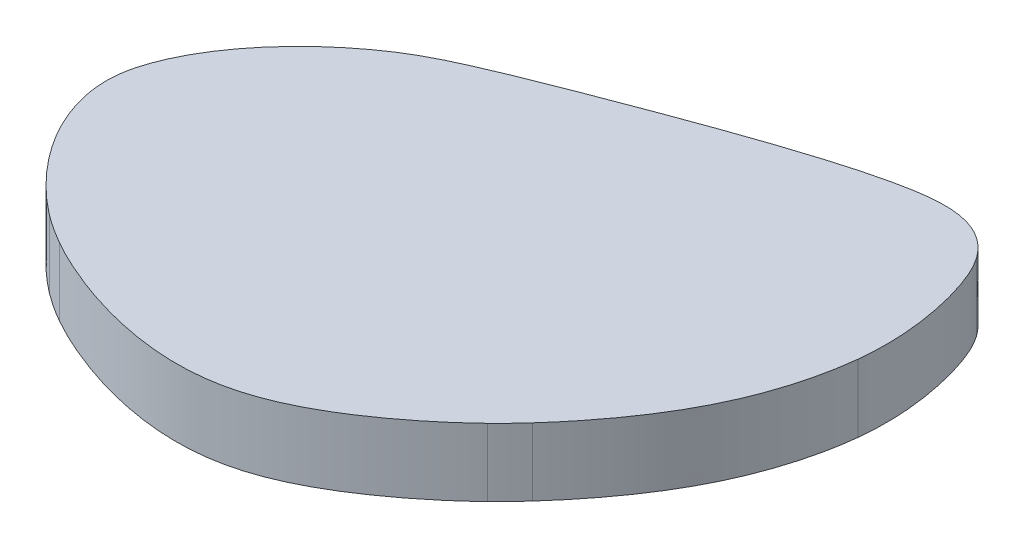
ISO-10303-21;
HEADER;
FILE_DESCRIPTION(('STEP AP214'),'2;1');
FILE_NAME('part.step','',(''),(''),'','','');
FILE_SCHEMA(('AUTOMOTIVE_DESIGN { 1 0 10303 214 1 1 1 1 }'));
ENDSEC;
DATA;
#1=APPLICATION_CONTEXT('core data for automotive mechanical design processes');
#2=APPLICATION_PROTOCOL_DEFINITION('international standard','automotive_design',2000,#1);
#3=PRODUCT_CONTEXT('',#1,'mechanical');
#4=PRODUCT('Part','Part','',(#3));
#5=PRODUCT_RELATED_PRODUCT_CATEGORY('part','',(#4));
#6=PRODUCT_DEFINITION_FORMATION('','',#4);
#7=PRODUCT_DEFINITION_CONTEXT('part definition',#1,'design');
#8=PRODUCT_DEFINITION('design','',#6,#7);
#9=PRODUCT_DEFINITION_SHAPE('','',#8);
#10=(LENGTH_UNIT() NAMED_UNIT(*) SI_UNIT(.MILLI.,.METRE.));
#11=(NAMED_UNIT(*) PLANE_ANGLE_UNIT() SI_UNIT($,.RADIAN.));
#12=(NAMED_UNIT(*) SI_UNIT($,.STERADIAN.) SOLID_ANGLE_UNIT());
#13=UNCERTAINTY_MEASURE_WITH_UNIT(LENGTH_MEASURE(1.E-05),#10,'distance_accuracy_value','');
#14=(GEOMETRIC_REPRESENTATION_CONTEXT(3) GLOBAL_UNCERTAINTY_ASSIGNED_CONTEXT((#13)) GLOBAL_UNIT_ASSIGNED_CONTEXT((#10,
#11,#12)) REPRESENTATION_CONTEXT('',''));
#15=CARTESIAN_POINT('',(0.,0.,0.));
#16=DIRECTION('',(0.,0.,1.));
#17=DIRECTION('',(1.,0.,0.));
#18=AXIS2_PLACEMENT_3D('',#15,#16,#17);
#19=CARTESIAN_POINT('',(9.40449868987964,3.,-11.5325854162938));
#20=CARTESIAN_POINT('',(9.16948442996962,3.,-11.5217221758173));
#21=CARTESIAN_POINT('',(8.92883504326752,3.,-11.4968709062009));
#22=CARTESIAN_POINT('',(8.43955719733286,3.,-11.4284514459938));
#23=CARTESIAN_POINT('',(8.18986316259901,3.,-11.3846441268283));
#24=CARTESIAN_POINT('',(7.44104489746572,3.,-11.2355085131655));
#25=CARTESIAN_POINT('',(6.94264632868885,3.,-11.1134848834787));
#26=CARTESIAN_POINT('',(5.94915151704761,3.,-10.8468969870508));
#27=CARTESIAN_POINT('',(5.45756725828822,3.,-10.7027869868344));
#28=CARTESIAN_POINT('',(4.48048933265871,3.,-10.4013940294703));
#29=CARTESIAN_POINT('',(3.99506288789248,3.,-10.2439687411717));
#30=CARTESIAN_POINT('',(3.51163535597027,3.,-10.0819931193588));
#31=B_SPLINE_CURVE_WITH_KNOTS('',3,(#19,#20,#21,#22,#23,#24,#25,#26,#27,#28,#29,#30),
.UNSPECIFIED.,.F.,.F.,(4,2,2,2,2,4),(0.,0.12500000000001,0.250000000000019,0.500000000000013,
0.750000000000006,1.),.UNSPECIFIED.);
#32=DIRECTION('',(0.,-1.,0.));
#33=VECTOR('',#32,1.);
#34=SURFACE_OF_LINEAR_EXTRUSION('',#31,#33);
#35=CARTESIAN_POINT('',(9.40449868987964,0.,-11.5325854162938));
#36=CARTESIAN_POINT('',(9.16948442996962,0.,-11.5217221758173));
#37=CARTESIAN_POINT('',(8.92883504326752,0.,-11.4968709062009));
#38=CARTESIAN_POINT('',(8.43955719733286,0.,-11.4284514459938));
#39=CARTESIAN_POINT('',(8.18986316259901,0.,-11.3846441268283));
#40=CARTESIAN_POINT('',(7.44104489746572,0.,-11.2355085131655));
#41=CARTESIAN_POINT('',(6.94264632868885,0.,-11.1134848834787));
#42=CARTESIAN_POINT('',(5.94915151704761,0.,-10.8468969870508));
#43=CARTESIAN_POINT('',(5.45756725828822,0.,-10.7027869868344));
#44=CARTESIAN_POINT('',(4.48048933265871,0.,-10.4013940294703));
#45=CARTESIAN_POINT('',(3.99506288789248,0.,-10.2439687411717));
#46=CARTESIAN_POINT('',(3.51163535597027,0.,-10.0819931193588));
#47=B_SPLINE_CURVE_WITH_KNOTS('',3,(#35,#36,#37,#38,#39,#40,#41,#42,#43,#44,#45,#46),
.UNSPECIFIED.,.F.,.F.,(4,2,2,2,2,4),(0.,0.12500000000001,0.250000000000019,0.500000000000013,
0.750000000000006,1.),.UNSPECIFIED.);
#48=CARTESIAN_POINT('',(9.40449868987964,0.,-11.5325854162938));
#49=VERTEX_POINT('',#48);
#50=CARTESIAN_POINT('',(3.51163535597027,0.,-10.0819931193588));
#51=VERTEX_POINT('',#50);
#52=EDGE_CURVE('E488',#49,#51,#47,.T.);
#53=ORIENTED_EDGE('',*,*,#52,.T.);
#54=DIRECTION('',(0.,-1.,0.));
#55=VECTOR('',#54,1.);
#56=CARTESIAN_POINT('',(3.51163535597027,3.,-10.0819931193588));
#57=LINE('',#56,#55);
#58=CARTESIAN_POINT('',(3.51163535597027,3.,-10.0819931193588));
#59=VERTEX_POINT('',#58);
#60=EDGE_CURVE('E11',#59,#51,#57,.T.);
#61=ORIENTED_EDGE('',*,*,#60,.F.);
#62=CARTESIAN_POINT('',(3.51163535597027,3.,-10.0819931193588));
#63=CARTESIAN_POINT('',(3.99506288789248,3.,-10.2439687411717));
#64=CARTESIAN_POINT('',(4.48048933265871,3.,-10.4013940294703));
#65=CARTESIAN_POINT('',(5.45756725828822,3.,-10.7027869868344));
#66=CARTESIAN_POINT('',(5.94915151704761,3.,-10.8468969870508));
#67=CARTESIAN_POINT('',(6.94264632868885,3.,-11.1134848834787));
#68=CARTESIAN_POINT('',(7.44104489746572,3.,-11.2355085131655));
#69=CARTESIAN_POINT('',(8.18986316259901,3.,-11.3846441268283));
#70=CARTESIAN_POINT('',(8.43955719733286,3.,-11.4284514459938));
#71=CARTESIAN_POINT('',(8.92883504326752,3.,-11.4968709062009));
#72=CARTESIAN_POINT('',(9.16948442996962,3.,-11.5217221758173));
#73=CARTESIAN_POINT('',(9.40449868987964,3.,-11.5325854162938));
#74=B_SPLINE_CURVE_WITH_KNOTS('',3,(#62,#63,#64,#65,#66,#67,#68,#69,#70,#71,#72,#73),
.UNSPECIFIED.,.F.,.F.,(4,2,2,2,2,4),(0.,0.249999999999994,0.499999999999987,0.749999999999981,
0.87499999999999,1.),.UNSPECIFIED.);
#75=CARTESIAN_POINT('',(9.40449868987964,3.,-11.5325854162938));
#76=VERTEX_POINT('',#75);
#77=EDGE_CURVE('E513',#76,#59,#74,.F.);
#78=ORIENTED_EDGE('',*,*,#77,.F.);
#79=DIRECTION('',(0.,-1.,0.));
#80=VECTOR('',#79,1.);
#81=CARTESIAN_POINT('',(9.40449868987964,3.,-11.5325854162938));
#82=LINE('',#81,#80);
#83=EDGE_CURVE('E495',#76,#49,#82,.T.);
#84=ORIENTED_EDGE('',*,*,#83,.T.);
#85=EDGE_LOOP('',(#53,#61,#78,#84));
#86=FACE_BOUND('',#85,.T.);
#87=ADVANCED_FACE('F35',(#86),#34,.F.);
#88=CARTESIAN_POINT('',(3.51163535597027,3.,-10.0819931193588));
#89=CARTESIAN_POINT('',(2.68377735277675,3.,-9.80461376881425));
#90=CARTESIAN_POINT('',(1.86383555225972,3.,-9.51516032948546));
#91=CARTESIAN_POINT('',(0.230253692953097,3.,-8.92378979456154));
#92=CARTESIAN_POINT('',(-0.583224168511143,3.,-8.62160702577619));
#93=CARTESIAN_POINT('',(-2.20639603395772,3.,-8.00841939522107));
#94=CARTESIAN_POINT('',(-3.01627374298358,3.,-7.69763269894974));
#95=CARTESIAN_POINT('',(-4.62896295436094,3.,-7.0621633178482));
#96=CARTESIAN_POINT('',(-5.43274745274563,3.,-6.73892739926996));
#97=CARTESIAN_POINT('',(-6.21792626872969,3.,-6.38973778627228));
#98=B_SPLINE_CURVE_WITH_KNOTS('',3,(#88,#89,#90,#91,#92,#93,#94,#95,#96,#97),.UNSPECIFIED.,.F.,
.F.,(4,2,2,2,4),(0.,0.25,0.5,0.75,1.),.UNSPECIFIED.);
#99=DIRECTION('',(0.,-1.,0.));
#100=VECTOR('',#99,1.);
#101=SURFACE_OF_LINEAR_EXTRUSION('',#98,#100);
#102=CARTESIAN_POINT('',(3.51163535597027,0.,-10.0819931193588));
#103=CARTESIAN_POINT('',(2.68377735277675,0.,-9.80461376881425));
#104=CARTESIAN_POINT('',(1.86383555225972,0.,-9.51516032948546));
#105=CARTESIAN_POINT('',(0.230253692953097,0.,-8.92378979456154));
#106=CARTESIAN_POINT('',(-0.583224168511143,0.,-8.62160702577619));
#107=CARTESIAN_POINT('',(-2.20639603395772,0.,-8.00841939522107));
#108=CARTESIAN_POINT('',(-3.01627374298358,0.,-7.69763269894974));
#109=CARTESIAN_POINT('',(-4.62896295436094,0.,-7.0621633178482));
#110=CARTESIAN_POINT('',(-5.43274745274563,0.,-6.73892739926996));
#111=CARTESIAN_POINT('',(-6.21792626872969,0.,-6.38973778627228));
#112=B_SPLINE_CURVE_WITH_KNOTS('',3,(#102,#103,#104,#105,#106,#107,#108,#109,#110,#111),
.UNSPECIFIED.,.F.,.F.,(4,2,2,2,4),(0.,0.25,0.5,0.75,1.),.UNSPECIFIED.);
#113=CARTESIAN_POINT('',(-6.21792626872969,0.,-6.38973778627228));
#114=VERTEX_POINT('',#113);
#115=EDGE_CURVE('E487',#51,#114,#112,.T.);
#116=ORIENTED_EDGE('',*,*,#115,.T.);
#117=DIRECTION('',(0.,-1.,0.));
#118=VECTOR('',#117,1.);
#119=CARTESIAN_POINT('',(-6.21792626872969,3.,-6.38973778627228));
#120=LINE('',#119,#118);
#121=CARTESIAN_POINT('',(-6.21792626872969,3.,-6.38973778627228));
#122=VERTEX_POINT('',#121);
#123=EDGE_CURVE('E48',#122,#114,#120,.T.);
#124=ORIENTED_EDGE('',*,*,#123,.F.);
#125=CARTESIAN_POINT('',(-6.21792626872969,3.,-6.38973778627228));
#126=CARTESIAN_POINT('',(-5.43274745274563,3.,-6.73892739926996));
#127=CARTESIAN_POINT('',(-4.62896295436094,3.,-7.0621633178482));
#128=CARTESIAN_POINT('',(-3.01627374298358,3.,-7.69763269894974));
#129=CARTESIAN_POINT('',(-2.20639603395772,3.,-8.00841939522107));
#130=CARTESIAN_POINT('',(-0.583224168511143,3.,-8.62160702577619));
#131=CARTESIAN_POINT('',(0.230253692953097,3.,-8.92378979456154));
#132=CARTESIAN_POINT('',(1.86383555225972,3.,-9.51516032948546));
#133=CARTESIAN_POINT('',(2.68377735277675,3.,-9.80461376881425));
#134=CARTESIAN_POINT('',(3.51163535597027,3.,-10.0819931193588));
#135=B_SPLINE_CURVE_WITH_KNOTS('',3,(#125,#126,#127,#128,#129,#130,#131,#132,#133,#134),
.UNSPECIFIED.,.F.,.F.,(4,2,2,2,4),(0.,0.25,0.5,0.75,1.),.UNSPECIFIED.);
#136=EDGE_CURVE('E115',#59,#122,#135,.F.);
#137=ORIENTED_EDGE('',*,*,#136,.F.);
#138=ORIENTED_EDGE('',*,*,#60,.T.);
#139=EDGE_LOOP('',(#116,#124,#137,#138));
#140=FACE_BOUND('',#139,.T.);
#141=ADVANCED_FACE('F285',(#140),#101,.F.);
#142=CARTESIAN_POINT('',(-6.21792626872969,3.,-6.38973778627228));
#143=CARTESIAN_POINT('',(-6.73238281775807,3.,-6.16094546585577));
#144=CARTESIAN_POINT('',(-7.23446368264175,3.,-5.92162292411225));
#145=CARTESIAN_POINT('',(-8.18354620617628,3.,-5.3954559909416));
#146=CARTESIAN_POINT('',(-8.62655194044665,3.,-5.10527133357896));
#147=CARTESIAN_POINT('',(-9.04879031403666,3.,-4.79311725753839));
#148=B_SPLINE_CURVE_WITH_KNOTS('',3,(#142,#143,#144,#145,#146,#147),.UNSPECIFIED.,.F.,.F.,(4,2,
4),(0.,0.5,1.),.UNSPECIFIED.);
#149=DIRECTION('',(0.,-1.,0.));
#150=VECTOR('',#149,1.);
#151=SURFACE_OF_LINEAR_EXTRUSION('',#148,#150);
#152=CARTESIAN_POINT('',(-6.21792626872969,0.,-6.38973778627228));
#153=CARTESIAN_POINT('',(-6.73238281775807,0.,-6.16094546585577));
#154=CARTESIAN_POINT('',(-7.23446368264175,0.,-5.92162292411225));
#155=CARTESIAN_POINT('',(-8.18354620617628,0.,-5.3954559909416));
#156=CARTESIAN_POINT('',(-8.62655194044665,0.,-5.10527133357896));
#157=CARTESIAN_POINT('',(-9.04879031403666,0.,-4.79311725753839));
#158=B_SPLINE_CURVE_WITH_KNOTS('',3,(#152,#153,#154,#155,#156,#157),.UNSPECIFIED.,.F.,.F.,(4,2,
4),(0.,0.5,1.),.UNSPECIFIED.);
#159=CARTESIAN_POINT('',(-9.04879031403666,0.,-4.79311725753839));
#160=VERTEX_POINT('',#159);
#161=EDGE_CURVE('E374',#114,#160,#158,.T.);
#162=ORIENTED_EDGE('',*,*,#161,.T.);
#163=DIRECTION('',(0.,-1.,0.));
#164=VECTOR('',#163,1.);
#165=CARTESIAN_POINT('',(-9.04879031403666,3.,-4.79311725753839));
#166=LINE('',#165,#164);
#167=CARTESIAN_POINT('',(-9.04879031403666,3.,-4.79311725753839));
#168=VERTEX_POINT('',#167);
#169=EDGE_CURVE('E373',#168,#160,#166,.T.);
#170=ORIENTED_EDGE('',*,*,#169,.F.);
#171=CARTESIAN_POINT('',(-9.04879031403666,3.,-4.79311725753839));
#172=CARTESIAN_POINT('',(-8.62655194044665,3.,-5.10527133357896));
#173=CARTESIAN_POINT('',(-8.18354620617628,3.,-5.3954559909416));
#174=CARTESIAN_POINT('',(-7.23446368264175,3.,-5.92162292411225));
#175=CARTESIAN_POINT('',(-6.73238281775807,3.,-6.16094546585577));
#176=CARTESIAN_POINT('',(-6.21792626872969,3.,-6.38973778627228));
#177=B_SPLINE_CURVE_WITH_KNOTS('',3,(#171,#172,#173,#174,#175,#176),.UNSPECIFIED.,.F.,.F.,(4,2,
4),(0.,0.5,1.),.UNSPECIFIED.);
#178=EDGE_CURVE('E365',#122,#168,#177,.F.);
#179=ORIENTED_EDGE('',*,*,#178,.F.);
#180=ORIENTED_EDGE('',*,*,#123,.T.);
#181=EDGE_LOOP('',(#162,#170,#179,#180));
#182=FACE_BOUND('',#181,.T.);
#183=ADVANCED_FACE('F295',(#182),#151,.F.);
#184=CARTESIAN_POINT('',(-9.04879031403666,3.,-4.79311725753839));
#185=CARTESIAN_POINT('',(-9.57259381540526,3.,-4.40587770707362));
#186=CARTESIAN_POINT('',(-10.0620145931181,3.,-3.9924961553342));
#187=CARTESIAN_POINT('',(-10.976896057484,3.,-3.11899282223826));
#188=CARTESIAN_POINT('',(-11.403271889311,3.,-2.6568625017252));
#189=CARTESIAN_POINT('',(-12.1805384485814,3.,-1.68119816733442));
#190=CARTESIAN_POINT('',(-12.5306293409266,3.,-1.16673020119945));
#191=CARTESIAN_POINT('',(-12.9800653843957,3.,-0.351507060059986));
#192=CARTESIAN_POINT('',(-13.1162939653667,3.,-0.073646384200321));
#193=CARTESIAN_POINT('',(-13.3552240747009,3.,0.496551982563431));
#194=CARTESIAN_POINT('',(-13.4585321407873,3.,0.788753111312324));
#195=CARTESIAN_POINT('',(-13.5371022169438,3.,1.09048307716147));
#196=B_SPLINE_CURVE_WITH_KNOTS('',3,(#184,#185,#186,#187,#188,#189,#190,#191,#192,#193,#194,
#195),.UNSPECIFIED.,.F.,.F.,(4,2,2,2,2,4),(0.,0.25,0.499999999999999,0.749999999999999,
0.874999999999999,1.),.UNSPECIFIED.);
#197=DIRECTION('',(0.,-1.,0.));
#198=VECTOR('',#197,1.);
#199=SURFACE_OF_LINEAR_EXTRUSION('',#196,#198);
#200=CARTESIAN_POINT('',(-9.04879031403666,0.,-4.79311725753839));
#201=CARTESIAN_POINT('',(-9.57259381540526,0.,-4.40587770707362));
#202=CARTESIAN_POINT('',(-10.0620145931181,0.,-3.9924961553342));
#203=CARTESIAN_POINT('',(-10.976896057484,0.,-3.11899282223826));
#204=CARTESIAN_POINT('',(-11.403271889311,0.,-2.6568625017252));
#205=CARTESIAN_POINT('',(-12.1805384485814,0.,-1.68119816733442));
#206=CARTESIAN_POINT('',(-12.5306293409266,0.,-1.16673020119945));
#207=CARTESIAN_POINT('',(-12.9800653843957,0.,-0.351507060059986));
#208=CARTESIAN_POINT('',(-13.1162939653667,0.,-0.073646384200321));
#209=CARTESIAN_POINT('',(-13.3552240747009,0.,0.496551982563431));
#210=CARTESIAN_POINT('',(-13.4585321407873,0.,0.788753111312324));
#211=CARTESIAN_POINT('',(-13.5371022169438,0.,1.09048307716147));
#212=B_SPLINE_CURVE_WITH_KNOTS('',3,(#200,#201,#202,#203,#204,#205,#206,#207,#208,#209,#210,
#211),.UNSPECIFIED.,.F.,.F.,(4,2,2,2,2,4),(0.,0.25,0.499999999999999,0.749999999999999,
0.874999999999999,1.),.UNSPECIFIED.);
#213=CARTESIAN_POINT('',(-13.5371022169438,0.,1.09048307716147));
#214=VERTEX_POINT('',#213);
#215=EDGE_CURVE('E356',#160,#214,#212,.T.);
#216=ORIENTED_EDGE('',*,*,#215,.T.);
#217=DIRECTION('',(0.,-1.,0.));
#218=VECTOR('',#217,1.);
#219=CARTESIAN_POINT('',(-13.5371022169438,3.,1.09048307716147));
#220=LINE('',#219,#218);
#221=CARTESIAN_POINT('',(-13.5371022169438,3.,1.09048307716147));
#222=VERTEX_POINT('',#221);
#223=EDGE_CURVE('E376',#222,#214,#220,.T.);
#224=ORIENTED_EDGE('',*,*,#223,.F.);
#225=CARTESIAN_POINT('',(-13.5371022169438,3.,1.09048307716147));
#226=CARTESIAN_POINT('',(-13.4585321407873,3.,0.788753111312324));
#227=CARTESIAN_POINT('',(-13.3552240747009,3.,0.496551982563431));
#228=CARTESIAN_POINT('',(-13.1162939653667,3.,-0.073646384200321));
#229=CARTESIAN_POINT('',(-12.9800653843957,3.,-0.351507060059986));
#230=CARTESIAN_POINT('',(-12.5306293409266,3.,-1.16673020119945));
#231=CARTESIAN_POINT('',(-12.1805384485814,3.,-1.68119816733442));
#232=CARTESIAN_POINT('',(-11.403271889311,3.,-2.6568625017252));
#233=CARTESIAN_POINT('',(-10.976896057484,3.,-3.11899282223826));
#234=CARTESIAN_POINT('',(-10.0620145931181,3.,-3.9924961553342));
#235=CARTESIAN_POINT('',(-9.57259381540526,3.,-4.40587770707362));
#236=CARTESIAN_POINT('',(-9.04879031403666,3.,-4.79311725753839));
#237=B_SPLINE_CURVE_WITH_KNOTS('',3,(#225,#226,#227,#228,#229,#230,#231,#232,#233,#234,#235,
#236),.UNSPECIFIED.,.F.,.F.,(4,2,2,2,2,4),(0.,0.125000000000001,0.250000000000001,
0.500000000000001,0.75,1.),.UNSPECIFIED.);
#238=EDGE_CURVE('E368',#168,#222,#237,.F.);
#239=ORIENTED_EDGE('',*,*,#238,.F.);
#240=ORIENTED_EDGE('',*,*,#169,.T.);
#241=EDGE_LOOP('',(#216,#224,#239,#240));
#242=FACE_BOUND('',#241,.T.);
#243=ADVANCED_FACE('F327',(#242),#199,.F.);
#244=CARTESIAN_POINT('',(-13.5371022169438,3.,1.09048307716147));
#245=CARTESIAN_POINT('',(-13.6045033382816,3.,1.34932128908943));
#246=CARTESIAN_POINT('',(-13.6533123475046,3.,1.61066942936922));
#247=CARTESIAN_POINT('',(-13.6986330861484,3.,2.13842771563338));
#248=CARTESIAN_POINT('',(-13.6947668012091,3.,2.40484478231628));
#249=CARTESIAN_POINT('',(-13.669095991079,3.,2.67430412253611));
#250=B_SPLINE_CURVE_WITH_KNOTS('',3,(#244,#245,#246,#247,#248,#249),.UNSPECIFIED.,.F.,.F.,(4,2,
4),(0.,0.5,1.),.UNSPECIFIED.);
#251=DIRECTION('',(0.,-1.,0.));
#252=VECTOR('',#251,1.);
#253=SURFACE_OF_LINEAR_EXTRUSION('',#250,#252);
#254=CARTESIAN_POINT('',(-13.5371022169438,0.,1.09048307716147));
#255=CARTESIAN_POINT('',(-13.6045033382816,0.,1.34932128908943));
#256=CARTESIAN_POINT('',(-13.6533123475046,0.,1.61066942936922));
#257=CARTESIAN_POINT('',(-13.6986330861484,0.,2.13842771563338));
#258=CARTESIAN_POINT('',(-13.6947668012091,0.,2.40484478231628));
#259=CARTESIAN_POINT('',(-13.669095991079,0.,2.67430412253611));
#260=B_SPLINE_CURVE_WITH_KNOTS('',3,(#254,#255,#256,#257,#258,#259),.UNSPECIFIED.,.F.,.F.,(4,2,
4),(0.,0.5,1.),.UNSPECIFIED.);
#261=CARTESIAN_POINT('',(-13.669095991079,0.,2.67430412253611));
#262=VERTEX_POINT('',#261);
#263=EDGE_CURVE('E481',#214,#262,#260,.T.);
#264=ORIENTED_EDGE('',*,*,#263,.T.);
#265=DIRECTION('',(0.,-1.,0.));
#266=VECTOR('',#265,1.);
#267=CARTESIAN_POINT('',(-13.669095991079,3.,2.67430412253611));
#268=LINE('',#267,#266);
#269=CARTESIAN_POINT('',(-13.669095991079,3.,2.67430412253611));
#270=VERTEX_POINT('',#269);
#271=EDGE_CURVE('E752',#270,#262,#268,.T.);
#272=ORIENTED_EDGE('',*,*,#271,.F.);
#273=CARTESIAN_POINT('',(-13.669095991079,3.,2.67430412253611));
#274=CARTESIAN_POINT('',(-13.6947668012091,3.,2.40484478231628));
#275=CARTESIAN_POINT('',(-13.6986330861484,3.,2.13842771563338));
#276=CARTESIAN_POINT('',(-13.6533123475046,3.,1.61066942936922));
#277=CARTESIAN_POINT('',(-13.6045033382816,3.,1.34932128908943));
#278=CARTESIAN_POINT('',(-13.5371022169438,3.,1.09048307716147));
#279=B_SPLINE_CURVE_WITH_KNOTS('',3,(#273,#274,#275,#276,#277,#278),.UNSPECIFIED.,.F.,.F.,(4,2,
4),(0.,0.5,1.),.UNSPECIFIED.);
#280=EDGE_CURVE('E379',#222,#270,#279,.F.);
#281=ORIENTED_EDGE('',*,*,#280,.F.);
#282=ORIENTED_EDGE('',*,*,#223,.T.);
#283=EDGE_LOOP('',(#264,#272,#281,#282));
#284=FACE_BOUND('',#283,.T.);
#285=ADVANCED_FACE('F331',(#284),#253,.F.);
#286=CARTESIAN_POINT('',(-13.669095991079,3.,2.67430412253611));
#287=CARTESIAN_POINT('',(-13.6147224729071,3.,3.24504779129842));
#288=CARTESIAN_POINT('',(-13.465072101567,3.,3.80194779583387));
#289=CARTESIAN_POINT('',(-13.1323267921578,3.,4.62518272633644));
#290=CARTESIAN_POINT('',(-13.0027710476083,3.,4.89731418090062));
#291=CARTESIAN_POINT('',(-12.7167081485253,3.,5.42476473443272));
#292=CARTESIAN_POINT('',(-12.5592701180152,3.,5.68175265159388));
#293=CARTESIAN_POINT('',(-12.0487095160506,3.,6.43472982768702));
#294=CARTESIAN_POINT('',(-11.6581424337949,3.,6.91487579660268));
#295=CARTESIAN_POINT('',(-10.7900867173167,3.,7.82595612707851));
#296=CARTESIAN_POINT('',(-10.3221618314719,3.,8.25214747014283));
#297=CARTESIAN_POINT('',(-9.81277976489491,3.,8.63842530460388));
#298=B_SPLINE_CURVE_WITH_KNOTS('',3,(#286,#287,#288,#289,#290,#291,#292,#293,#294,#295,#296,
#297),.UNSPECIFIED.,.F.,.F.,(4,2,2,2,2,4),(0.,0.249999999999982,0.374999999999986,
0.49999999999999,0.749999999999995,1.),.UNSPECIFIED.);
#299=DIRECTION('',(0.,-1.,0.));
#300=VECTOR('',#299,1.);
#301=SURFACE_OF_LINEAR_EXTRUSION('',#298,#300);
#302=CARTESIAN_POINT('',(-13.669095991079,0.,2.67430412253611));
#303=CARTESIAN_POINT('',(-13.6147224729071,0.,3.24504779129842));
#304=CARTESIAN_POINT('',(-13.465072101567,0.,3.80194779583387));
#305=CARTESIAN_POINT('',(-13.1323267921578,0.,4.62518272633644));
#306=CARTESIAN_POINT('',(-13.0027710476083,0.,4.89731418090062));
#307=CARTESIAN_POINT('',(-12.7167081485253,0.,5.42476473443272));
#308=CARTESIAN_POINT('',(-12.5592701180152,0.,5.68175265159388));
#309=CARTESIAN_POINT('',(-12.0487095160506,0.,6.43472982768702));
#310=CARTESIAN_POINT('',(-11.6581424337949,0.,6.91487579660268));
#311=CARTESIAN_POINT('',(-10.7900867173167,0.,7.82595612707851));
#312=CARTESIAN_POINT('',(-10.3221618314719,0.,8.25214747014283));
#313=CARTESIAN_POINT('',(-9.81277976489491,0.,8.63842530460388));
#314=B_SPLINE_CURVE_WITH_KNOTS('',3,(#302,#303,#304,#305,#306,#307,#308,#309,#310,#311,#312,
#313),.UNSPECIFIED.,.F.,.F.,(4,2,2,2,2,4),(0.,0.249999999999982,0.374999999999986,
0.49999999999999,0.749999999999995,1.),.UNSPECIFIED.);
#315=CARTESIAN_POINT('',(-9.81277976489491,0.,8.63842530460388));
#316=VERTEX_POINT('',#315);
#317=EDGE_CURVE('E476',#262,#316,#314,.T.);
#318=ORIENTED_EDGE('',*,*,#317,.T.);
#319=DIRECTION('',(0.,-1.,0.));
#320=VECTOR('',#319,1.);
#321=CARTESIAN_POINT('',(-9.81277976489491,3.,8.63842530460388));
#322=LINE('',#321,#320);
#323=CARTESIAN_POINT('',(-9.81277976489491,3.,8.63842530460388));
#324=VERTEX_POINT('',#323);
#325=EDGE_CURVE('E781',#324,#316,#322,.T.);
#326=ORIENTED_EDGE('',*,*,#325,.F.);
#327=CARTESIAN_POINT('',(-9.81277976489491,3.,8.63842530460388));
#328=CARTESIAN_POINT('',(-10.3221618314719,3.,8.25214747014283));
#329=CARTESIAN_POINT('',(-10.7900867173167,3.,7.82595612707851));
#330=CARTESIAN_POINT('',(-11.6581424337949,3.,6.91487579660268));
#331=CARTESIAN_POINT('',(-12.0487095160506,3.,6.43472982768702));
#332=CARTESIAN_POINT('',(-12.5592701180152,3.,5.68175265159388));
#333=CARTESIAN_POINT('',(-12.7167081485253,3.,5.42476473443272));
#334=CARTESIAN_POINT('',(-13.0027710476083,3.,4.89731418090062));
#335=CARTESIAN_POINT('',(-13.1323267921578,3.,4.62518272633644));
#336=CARTESIAN_POINT('',(-13.465072101567,3.,3.80194779583387));
#337=CARTESIAN_POINT('',(-13.6147224729071,3.,3.24504779129842));
#338=CARTESIAN_POINT('',(-13.669095991079,3.,2.67430412253611));
#339=B_SPLINE_CURVE_WITH_KNOTS('',3,(#327,#328,#329,#330,#331,#332,#333,#334,#335,#336,#337,
#338),.UNSPECIFIED.,.F.,.F.,(4,2,2,2,2,4),(0.,0.250000000000005,0.50000000000001,
0.625000000000014,0.750000000000018,1.),.UNSPECIFIED.);
#340=EDGE_CURVE('E380',#270,#324,#339,.F.);
#341=ORIENTED_EDGE('',*,*,#340,.F.);
#342=ORIENTED_EDGE('',*,*,#271,.T.);
#343=EDGE_LOOP('',(#318,#326,#341,#342));
#344=FACE_BOUND('',#343,.T.);
#345=ADVANCED_FACE('F445',(#344),#301,.F.);
#346=CARTESIAN_POINT('',(-9.81277976489491,3.,8.63842530460388));
#347=CARTESIAN_POINT('',(-9.40343625663864,3.,8.94884126600457));
#348=CARTESIAN_POINT('',(-8.97118766516436,3.,9.22809808730794));
#349=CARTESIAN_POINT('',(-8.52193759572628,3.,9.48393361835374));
#350=B_SPLINE_CURVE_WITH_KNOTS('',3,(#346,#347,#348,#349),.UNSPECIFIED.,.F.,.F.,(4,4),(0.,1.),.UNSPECIFIED.);
#351=DIRECTION('',(0.,-1.,0.));
#352=VECTOR('',#351,1.);
#353=SURFACE_OF_LINEAR_EXTRUSION('',#350,#352);
#354=CARTESIAN_POINT('',(-9.81277976489491,0.,8.63842530460388));
#355=CARTESIAN_POINT('',(-9.40343625663864,0.,8.94884126600457));
#356=CARTESIAN_POINT('',(-8.97118766516436,0.,9.22809808730794));
#357=CARTESIAN_POINT('',(-8.52193759572628,0.,9.48393361835374));
#358=B_SPLINE_CURVE_WITH_KNOTS('',3,(#354,#355,#356,#357),.UNSPECIFIED.,.F.,.F.,(4,4),(0.,1.),.UNSPECIFIED.);
#359=CARTESIAN_POINT('',(-8.52193759572628,0.,9.48393361835374));
#360=VERTEX_POINT('',#359);
#361=EDGE_CURVE('E467',#316,#360,#358,.T.);
#362=ORIENTED_EDGE('',*,*,#361,.T.);
#363=DIRECTION('',(0.,-1.,0.));
#364=VECTOR('',#363,1.);
#365=CARTESIAN_POINT('',(-8.52193759572628,3.,9.48393361835374));
#366=LINE('',#365,#364);
#367=CARTESIAN_POINT('',(-8.52193759572628,3.,9.48393361835374));
#368=VERTEX_POINT('',#367);
#369=EDGE_CURVE('E401',#368,#360,#366,.T.);
#370=ORIENTED_EDGE('',*,*,#369,.F.);
#371=CARTESIAN_POINT('',(-8.52193759572628,3.,9.48393361835374));
#372=CARTESIAN_POINT('',(-8.97118766516436,3.,9.22809808730794));
#373=CARTESIAN_POINT('',(-9.40343625663864,3.,8.94884126600457));
#374=CARTESIAN_POINT('',(-9.81277976489491,3.,8.63842530460388));
#375=B_SPLINE_CURVE_WITH_KNOTS('',3,(#371,#372,#373,#374),.UNSPECIFIED.,.F.,.F.,(4,4),(0.,1.),.UNSPECIFIED.);
#376=EDGE_CURVE('E382',#324,#368,#375,.F.);
#377=ORIENTED_EDGE('',*,*,#376,.F.);
#378=ORIENTED_EDGE('',*,*,#325,.T.);
#379=EDGE_LOOP('',(#362,#370,#377,#378));
#380=FACE_BOUND('',#379,.T.);
#381=ADVANCED_FACE('F442',(#380),#353,.F.);
#382=CARTESIAN_POINT('',(-8.52193759572628,3.,9.48393361835374));
#383=CARTESIAN_POINT('',(-7.86405668328516,3.,9.85857866361554));
#384=CARTESIAN_POINT('',(-7.18143256147119,3.,10.171414143231));
#385=CARTESIAN_POINT('',(-5.78638657795527,3.,10.7217086444897));
#386=CARTESIAN_POINT('',(-5.07185543548161,3.,10.9535376616802));
#387=CARTESIAN_POINT('',(-3.60527888625806,3.,11.3168666237345));
#388=CARTESIAN_POINT('',(-2.84947534911307,3.,11.4475782525453));
#389=CARTESIAN_POINT('',(-1.71821800290107,3.,11.5318237285615));
#390=CARTESIAN_POINT('',(-1.34024123356613,3.,11.5415476562711));
#391=CARTESIAN_POINT('',(-0.582297463101903,3.,11.5173035042926));
#392=CARTESIAN_POINT('',(-0.199738299052624,3.,11.4827527968533));
#393=CARTESIAN_POINT('',(0.92358170909734,3.,11.3044984143813));
#394=CARTESIAN_POINT('',(1.64363223502894,3.,11.086301788032));
#395=CARTESIAN_POINT('',(2.6907578221701,3.,10.6447584440295));
#396=CARTESIAN_POINT('',(3.03465279902015,3.,10.4782818192673));
#397=CARTESIAN_POINT('',(3.70062405165472,3.,10.1217783995795));
#398=CARTESIAN_POINT('',(4.0247759542611,3.,9.93107104447086));
#399=CARTESIAN_POINT('',(4.97712039997889,3.,9.33035035546884));
#400=CARTESIAN_POINT('',(5.58540791500917,3.,8.89202763303319));
#401=CARTESIAN_POINT('',(6.76400709185277,3.,7.96012609109291));
#402=CARTESIAN_POINT('',(7.33408199455755,3.,7.4662502485716));
#403=CARTESIAN_POINT('',(7.87948311482258,3.,6.93606945640489));
#404=B_SPLINE_CURVE_WITH_KNOTS('',3,(#382,#383,#384,#385,#386,#387,#388,#389,#390,#391,#392,
#393,#394,#395,#396,#397,#398,#399,#400,#401,#402,#403),.UNSPECIFIED.,.F.,.F.,(4,2,2,2,2,2,2,2,
2,2,4),(0.,0.125000000000009,0.250000000000018,0.375000000000027,0.437500000000029,
0.500000000000031,0.62500000000002,0.687500000000014,0.750000000000009,0.875000000000004,1.),.UNSPECIFIED.);
#405=DIRECTION('',(0.,-1.,0.));
#406=VECTOR('',#405,1.);
#407=SURFACE_OF_LINEAR_EXTRUSION('',#404,#406);
#408=CARTESIAN_POINT('',(-8.52193759572628,0.,9.48393361835374));
#409=CARTESIAN_POINT('',(-7.86405668328516,0.,9.85857866361554));
#410=CARTESIAN_POINT('',(-7.18143256147119,0.,10.171414143231));
#411=CARTESIAN_POINT('',(-5.78638657795527,0.,10.7217086444897));
#412=CARTESIAN_POINT('',(-5.07185543548161,0.,10.9535376616802));
#413=CARTESIAN_POINT('',(-3.60527888625806,0.,11.3168666237345));
#414=CARTESIAN_POINT('',(-2.84947534911307,0.,11.4475782525453));
#415=CARTESIAN_POINT('',(-1.71821800290107,0.,11.5318237285615));
#416=CARTESIAN_POINT('',(-1.34024123356613,0.,11.5415476562711));
#417=CARTESIAN_POINT('',(-0.582297463101903,0.,11.5173035042926));
#418=CARTESIAN_POINT('',(-0.199738299052624,0.,11.4827527968533));
#419=CARTESIAN_POINT('',(0.92358170909734,0.,11.3044984143813));
#420=CARTESIAN_POINT('',(1.64363223502894,0.,11.086301788032));
#421=CARTESIAN_POINT('',(2.6907578221701,0.,10.6447584440295));
#422=CARTESIAN_POINT('',(3.03465279902015,0.,10.4782818192673));
#423=CARTESIAN_POINT('',(3.70062405165472,0.,10.1217783995795));
#424=CARTESIAN_POINT('',(4.0247759542611,0.,9.93107104447086));
#425=CARTESIAN_POINT('',(4.97712039997889,0.,9.33035035546884));
#426=CARTESIAN_POINT('',(5.58540791500917,0.,8.89202763303319));
#427=CARTESIAN_POINT('',(6.76400709185277,0.,7.96012609109291));
#428=CARTESIAN_POINT('',(7.33408199455755,0.,7.4662502485716));
#429=CARTESIAN_POINT('',(7.87948311482258,0.,6.93606945640489));
#430=B_SPLINE_CURVE_WITH_KNOTS('',3,(#408,#409,#410,#411,#412,#413,#414,#415,#416,#417,#418,
#419,#420,#421,#422,#423,#424,#425,#426,#427,#428,#429),.UNSPECIFIED.,.F.,.F.,(4,2,2,2,2,2,2,2,
2,2,4),(0.,0.125000000000009,0.250000000000018,0.375000000000027,0.437500000000029,
0.500000000000031,0.62500000000002,0.687500000000014,0.750000000000009,0.875000000000004,1.),.UNSPECIFIED.);
#431=CARTESIAN_POINT('',(7.87948311482258,0.,6.93606945640489));
#432=VERTEX_POINT('',#431);
#433=EDGE_CURVE('E397',#360,#432,#430,.T.);
#434=ORIENTED_EDGE('',*,*,#433,.T.);
#435=DIRECTION('',(0.,-1.,0.));
#436=VECTOR('',#435,1.);
#437=CARTESIAN_POINT('',(7.87948311482258,3.,6.93606945640489));
#438=LINE('',#437,#436);
#439=CARTESIAN_POINT('',(7.87948311482258,3.,6.93606945640489));
#440=VERTEX_POINT('',#439);
#441=EDGE_CURVE('E394',#440,#432,#438,.T.);
#442=ORIENTED_EDGE('',*,*,#441,.F.);
#443=CARTESIAN_POINT('',(7.87948311482258,3.,6.93606945640489));
#444=CARTESIAN_POINT('',(7.33408199455755,3.,7.4662502485716));
#445=CARTESIAN_POINT('',(6.76400709185277,3.,7.96012609109291));
#446=CARTESIAN_POINT('',(5.58540791500917,3.,8.89202763303319));
#447=CARTESIAN_POINT('',(4.97712039997889,3.,9.33035035546884));
#448=CARTESIAN_POINT('',(4.0247759542611,3.,9.93107104447086));
#449=CARTESIAN_POINT('',(3.70062405165472,3.,10.1217783995795));
#450=CARTESIAN_POINT('',(3.03465279902015,3.,10.4782818192673));
#451=CARTESIAN_POINT('',(2.6907578221701,3.,10.6447584440295));
#452=CARTESIAN_POINT('',(1.64363223502894,3.,11.086301788032));
#453=CARTESIAN_POINT('',(0.92358170909734,3.,11.3044984143813));
#454=CARTESIAN_POINT('',(-0.199738299052624,3.,11.4827527968533));
#455=CARTESIAN_POINT('',(-0.582297463101903,3.,11.5173035042926));
#456=CARTESIAN_POINT('',(-1.34024123356613,3.,11.5415476562711));
#457=CARTESIAN_POINT('',(-1.71821800290107,3.,11.5318237285615));
#458=CARTESIAN_POINT('',(-2.84947534911307,3.,11.4475782525453));
#459=CARTESIAN_POINT('',(-3.60527888625806,3.,11.3168666237345));
#460=CARTESIAN_POINT('',(-5.07185543548161,3.,10.9535376616802));
#461=CARTESIAN_POINT('',(-5.78638657795527,3.,10.7217086444897));
#462=CARTESIAN_POINT('',(-7.18143256147119,3.,10.171414143231));
#463=CARTESIAN_POINT('',(-7.86405668328516,3.,9.85857866361554));
#464=CARTESIAN_POINT('',(-8.52193759572628,3.,9.48393361835374));
#465=B_SPLINE_CURVE_WITH_KNOTS('',3,(#443,#444,#445,#446,#447,#448,#449,#450,#451,#452,#453,
#454,#455,#456,#457,#458,#459,#460,#461,#462,#463,#464),.UNSPECIFIED.,.F.,.F.,(4,2,2,2,2,2,2,2,
2,2,4),(0.,0.124999999999996,0.249999999999991,0.312499999999986,0.37499999999998,
0.499999999999969,0.562499999999971,0.624999999999973,0.749999999999982,0.874999999999991,1.),.UNSPECIFIED.);
#466=EDGE_CURVE('E385',#368,#440,#465,.F.);
#467=ORIENTED_EDGE('',*,*,#466,.F.);
#468=ORIENTED_EDGE('',*,*,#369,.T.);
#469=EDGE_LOOP('',(#434,#442,#467,#468));
#470=FACE_BOUND('',#469,.T.);
#471=ADVANCED_FACE('F395',(#470),#407,.F.);
#472=CARTESIAN_POINT('',(7.87948311482258,3.,6.93606945640489));
#473=CARTESIAN_POINT('',(8.2169976311114,3.,6.60797384573324));
#474=CARTESIAN_POINT('',(8.54246376133928,3.,6.26806517082345));
#475=CARTESIAN_POINT('',(8.85886696687911,3.,5.91918810390617));
#476=B_SPLINE_CURVE_WITH_KNOTS('',3,(#472,#473,#474,#475),.UNSPECIFIED.,.F.,.F.,(4,4),(0.,1.),.UNSPECIFIED.);
#477=DIRECTION('',(0.,-1.,0.));
#478=VECTOR('',#477,1.);
#479=SURFACE_OF_LINEAR_EXTRUSION('',#476,#478);
#480=CARTESIAN_POINT('',(7.87948311482258,0.,6.93606945640489));
#481=CARTESIAN_POINT('',(8.2169976311114,0.,6.60797384573324));
#482=CARTESIAN_POINT('',(8.54246376133928,0.,6.26806517082345));
#483=CARTESIAN_POINT('',(8.85886696687911,0.,5.91918810390617));
#484=B_SPLINE_CURVE_WITH_KNOTS('',3,(#480,#481,#482,#483),.UNSPECIFIED.,.F.,.F.,(4,4),(0.,1.),.UNSPECIFIED.);
#485=CARTESIAN_POINT('',(8.85886696687911,0.,5.91918810390617));
#486=VERTEX_POINT('',#485);
#487=EDGE_CURVE('E480',#432,#486,#484,.T.);
#488=ORIENTED_EDGE('',*,*,#487,.T.);
#489=DIRECTION('',(0.,-1.,0.));
#490=VECTOR('',#489,1.);
#491=CARTESIAN_POINT('',(8.85886696687911,3.,5.91918810390617));
#492=LINE('',#491,#490);
#493=CARTESIAN_POINT('',(8.85886696687911,3.,5.91918810390617));
#494=VERTEX_POINT('',#493);
#495=EDGE_CURVE('E162',#494,#486,#492,.T.);
#496=ORIENTED_EDGE('',*,*,#495,.F.);
#497=CARTESIAN_POINT('',(8.85886696687911,3.,5.91918810390617));
#498=CARTESIAN_POINT('',(8.54246376133928,3.,6.26806517082345));
#499=CARTESIAN_POINT('',(8.2169976311114,3.,6.60797384573324));
#500=CARTESIAN_POINT('',(7.87948311482258,3.,6.93606945640489));
#501=B_SPLINE_CURVE_WITH_KNOTS('',3,(#497,#498,#499,#500),.UNSPECIFIED.,.F.,.F.,(4,4),(0.,1.),.UNSPECIFIED.);
#502=EDGE_CURVE('E149',#440,#494,#501,.F.);
#503=ORIENTED_EDGE('',*,*,#502,.F.);
#504=ORIENTED_EDGE('',*,*,#441,.T.);
#505=EDGE_LOOP('',(#488,#496,#503,#504));
#506=FACE_BOUND('',#505,.T.);
#507=ADVANCED_FACE('F403',(#506),#479,.F.);
#508=CARTESIAN_POINT('',(8.85886696687911,3.,5.91918810390617));
#509=CARTESIAN_POINT('',(9.17501200384786,3.,5.57059570254447));
#510=CARTESIAN_POINT('',(9.47780642557074,3.,5.21174449391658));
#511=CARTESIAN_POINT('',(10.0653583454772,3.,4.48038200057548));
#512=CARTESIAN_POINT('',(10.3501124372727,3.,4.10786453796401));
#513=CARTESIAN_POINT('',(10.894645503284,3.,3.34386854830214));
#514=CARTESIAN_POINT('',(11.1545242742398,3.,2.95218337976143));
#515=CARTESIAN_POINT('',(11.6404751068279,3.,2.16009302313152));
#516=CARTESIAN_POINT('',(11.867314109606,3.,1.7583153261641));
#517=CARTESIAN_POINT('',(12.2833933080917,3.,0.9417201520041));
#518=CARTESIAN_POINT('',(12.4722342131991,3.,0.526728056626447));
#519=CARTESIAN_POINT('',(12.8107300359578,3.,-0.315954521647243));
#520=CARTESIAN_POINT('',(12.9614480282783,3.,-0.745894363595578));
#521=CARTESIAN_POINT('',(13.3508996658441,3.,-2.03434566225764));
#522=CARTESIAN_POINT('',(13.527929445775,3.,-2.88254331050443));
#523=CARTESIAN_POINT('',(13.617402736091,3.,-3.71428225224758));
#524=B_SPLINE_CURVE_WITH_KNOTS('',3,(#508,#509,#510,#511,#512,#513,#514,#515,#516,#517,#518,
#519,#520,#521,#522,#523),.UNSPECIFIED.,.F.,.F.,(4,2,2,2,2,2,2,4),(0.,0.125,0.25,0.375,0.5,
0.625,0.75,1.),.UNSPECIFIED.);
#525=DIRECTION('',(0.,-1.,0.));
#526=VECTOR('',#525,1.);
#527=SURFACE_OF_LINEAR_EXTRUSION('',#524,#526);
#528=CARTESIAN_POINT('',(8.85886696687911,0.,5.91918810390617));
#529=CARTESIAN_POINT('',(9.17501200384786,0.,5.57059570254447));
#530=CARTESIAN_POINT('',(9.47780642557074,0.,5.21174449391658));
#531=CARTESIAN_POINT('',(10.0653583454772,0.,4.48038200057548));
#532=CARTESIAN_POINT('',(10.3501124372727,0.,4.10786453796401));
#533=CARTESIAN_POINT('',(10.894645503284,0.,3.34386854830214));
#534=CARTESIAN_POINT('',(11.1545242742398,0.,2.95218337976143));
#535=CARTESIAN_POINT('',(11.6404751068279,0.,2.16009302313152));
#536=CARTESIAN_POINT('',(11.867314109606,0.,1.7583153261641));
#537=CARTESIAN_POINT('',(12.2833933080917,0.,0.9417201520041));
#538=CARTESIAN_POINT('',(12.4722342131991,0.,0.526728056626447));
#539=CARTESIAN_POINT('',(12.8107300359578,0.,-0.315954521647243));
#540=CARTESIAN_POINT('',(12.9614480282783,0.,-0.745894363595578));
#541=CARTESIAN_POINT('',(13.3508996658441,0.,-2.03434566225764));
#542=CARTESIAN_POINT('',(13.527929445775,0.,-2.88254331050443));
#543=CARTESIAN_POINT('',(13.617402736091,0.,-3.71428225224758));
#544=B_SPLINE_CURVE_WITH_KNOTS('',3,(#528,#529,#530,#531,#532,#533,#534,#535,#536,#537,#538,
#539,#540,#541,#542,#543),.UNSPECIFIED.,.F.,.F.,(4,2,2,2,2,2,2,4),(0.,0.125,0.25,0.375,0.5,
0.625,0.75,1.),.UNSPECIFIED.);
#545=CARTESIAN_POINT('',(13.617402736091,0.,-3.71428225224758));
#546=VERTEX_POINT('',#545);
#547=EDGE_CURVE('E160',#486,#546,#544,.T.);
#548=ORIENTED_EDGE('',*,*,#547,.T.);
#549=DIRECTION('',(0.,-1.,0.));
#550=VECTOR('',#549,1.);
#551=CARTESIAN_POINT('',(13.617402736091,3.,-3.71428225224758));
#552=LINE('',#551,#550);
#553=CARTESIAN_POINT('',(13.617402736091,3.,-3.71428225224758));
#554=VERTEX_POINT('',#553);
#555=EDGE_CURVE('E157',#554,#546,#552,.T.);
#556=ORIENTED_EDGE('',*,*,#555,.F.);
#557=CARTESIAN_POINT('',(13.617402736091,3.,-3.71428225224758));
#558=CARTESIAN_POINT('',(13.527929445775,3.,-2.88254331050443));
#559=CARTESIAN_POINT('',(13.3508996658441,3.,-2.03434566225764));
#560=CARTESIAN_POINT('',(12.9614480282783,3.,-0.745894363595578));
#561=CARTESIAN_POINT('',(12.8107300359578,3.,-0.315954521647243));
#562=CARTESIAN_POINT('',(12.4722342131991,3.,0.526728056626447));
#563=CARTESIAN_POINT('',(12.2833933080917,3.,0.9417201520041));
#564=CARTESIAN_POINT('',(11.867314109606,3.,1.7583153261641));
#565=CARTESIAN_POINT('',(11.6404751068279,3.,2.16009302313152));
#566=CARTESIAN_POINT('',(11.1545242742398,3.,2.95218337976143));
#567=CARTESIAN_POINT('',(10.894645503284,3.,3.34386854830214));
#568=CARTESIAN_POINT('',(10.3501124372727,3.,4.10786453796401));
#569=CARTESIAN_POINT('',(10.0653583454772,3.,4.48038200057548));
#570=CARTESIAN_POINT('',(9.47780642557074,3.,5.21174449391658));
#571=CARTESIAN_POINT('',(9.17501200384786,3.,5.57059570254447));
#572=CARTESIAN_POINT('',(8.85886696687911,3.,5.91918810390617));
#573=B_SPLINE_CURVE_WITH_KNOTS('',3,(#557,#558,#559,#560,#561,#562,#563,#564,#565,#566,#567,
#568,#569,#570,#571,#572),.UNSPECIFIED.,.F.,.F.,(4,2,2,2,2,2,2,4),(0.,0.25,0.375,0.5,0.625,0.75,
0.875,1.),.UNSPECIFIED.);
#574=EDGE_CURVE('E141',#494,#554,#573,.F.);
#575=ORIENTED_EDGE('',*,*,#574,.F.);
#576=ORIENTED_EDGE('',*,*,#495,.T.);
#577=EDGE_LOOP('',(#548,#556,#575,#576));
#578=FACE_BOUND('',#577,.T.);
#579=ADVANCED_FACE('F158',(#578),#527,.F.);
#580=CARTESIAN_POINT('',(13.617402736091,3.,-3.71428225224758));
#581=CARTESIAN_POINT('',(13.6913773163926,3.,-4.4019460112975));
#582=CARTESIAN_POINT('',(13.6986330861493,3.,-5.05607891301228));
#583=CARTESIAN_POINT('',(13.6168292681195,3.,-6.2995249331993));
#584=CARTESIAN_POINT('',(13.5293843482253,3.,-6.89099840873572));
#585=CARTESIAN_POINT('',(13.3576433151154,3.,-7.71256305898873));
#586=CARTESIAN_POINT('',(13.2935807285411,3.,-7.97648538927618));
#587=CARTESIAN_POINT('',(13.1516748106571,3.,-8.48496566402187));
#588=CARTESIAN_POINT('',(13.0736960178476,3.,-8.72971103892782));
#589=CARTESIAN_POINT('',(12.8189948401512,3.,-9.42855375363388));
#590=CARTESIAN_POINT('',(12.6248974016404,3.,-9.85093084940269));
#591=CARTESIAN_POINT('',(12.3640409776146,3.,-10.2202388783838));
#592=B_SPLINE_CURVE_WITH_KNOTS('',3,(#580,#581,#582,#583,#584,#585,#586,#587,#588,#589,#590,
#591),.UNSPECIFIED.,.F.,.F.,(4,2,2,2,2,4),(0.,0.249999999999998,0.499999999999996,
0.624999999999995,0.749999999999995,1.),.UNSPECIFIED.);
#593=DIRECTION('',(0.,-1.,0.));
#594=VECTOR('',#593,1.);
#595=SURFACE_OF_LINEAR_EXTRUSION('',#592,#594);
#596=CARTESIAN_POINT('',(13.617402736091,0.,-3.71428225224758));
#597=CARTESIAN_POINT('',(13.6913773163926,0.,-4.4019460112975));
#598=CARTESIAN_POINT('',(13.6986330861493,0.,-5.05607891301228));
#599=CARTESIAN_POINT('',(13.6168292681195,0.,-6.2995249331993));
#600=CARTESIAN_POINT('',(13.5293843482253,0.,-6.89099840873572));
#601=CARTESIAN_POINT('',(13.3576433151154,0.,-7.71256305898873));
#602=CARTESIAN_POINT('',(13.2935807285411,0.,-7.97648538927618));
#603=CARTESIAN_POINT('',(13.1516748106571,0.,-8.48496566402187));
#604=CARTESIAN_POINT('',(13.0736960178476,0.,-8.72971103892782));
#605=CARTESIAN_POINT('',(12.8189948401512,0.,-9.42855375363388));
#606=CARTESIAN_POINT('',(12.6248974016404,0.,-9.85093084940269));
#607=CARTESIAN_POINT('',(12.3640409776146,0.,-10.2202388783838));
#608=B_SPLINE_CURVE_WITH_KNOTS('',3,(#596,#597,#598,#599,#600,#601,#602,#603,#604,#605,#606,
#607),.UNSPECIFIED.,.F.,.F.,(4,2,2,2,2,4),(0.,0.249999999999998,0.499999999999996,
0.624999999999995,0.749999999999995,1.),.UNSPECIFIED.);
#609=CARTESIAN_POINT('',(12.3640409776146,0.,-10.2202388783838));
#610=VERTEX_POINT('',#609);
#611=EDGE_CURVE('E99',#546,#610,#608,.T.);
#612=ORIENTED_EDGE('',*,*,#611,.T.);
#613=DIRECTION('',(0.,-1.,0.));
#614=VECTOR('',#613,1.);
#615=CARTESIAN_POINT('',(12.3640409776146,3.,-10.2202388783838));
#616=LINE('',#615,#614);
#617=CARTESIAN_POINT('',(12.3640409776146,3.,-10.2202388783838));
#618=VERTEX_POINT('',#617);
#619=EDGE_CURVE('E163',#618,#610,#616,.T.);
#620=ORIENTED_EDGE('',*,*,#619,.F.);
#621=CARTESIAN_POINT('',(12.3640409776146,3.,-10.2202388783838));
#622=CARTESIAN_POINT('',(12.6248974016404,3.,-9.85093084940269));
#623=CARTESIAN_POINT('',(12.8189948401512,3.,-9.42855375363388));
#624=CARTESIAN_POINT('',(13.0736960178476,3.,-8.72971103892782));
#625=CARTESIAN_POINT('',(13.1516748106571,3.,-8.48496566402187));
#626=CARTESIAN_POINT('',(13.2935807285411,3.,-7.97648538927618));
#627=CARTESIAN_POINT('',(13.3576433151154,3.,-7.71256305898873));
#628=CARTESIAN_POINT('',(13.5293843482253,3.,-6.89099840873572));
#629=CARTESIAN_POINT('',(13.6168292681195,3.,-6.2995249331993));
#630=CARTESIAN_POINT('',(13.6986330861493,3.,-5.05607891301228));
#631=CARTESIAN_POINT('',(13.6913773163926,3.,-4.4019460112975));
#632=CARTESIAN_POINT('',(13.617402736091,3.,-3.71428225224758));
#633=B_SPLINE_CURVE_WITH_KNOTS('',3,(#621,#622,#623,#624,#625,#626,#627,#628,#629,#630,#631,
#632),.UNSPECIFIED.,.F.,.F.,(4,2,2,2,2,4),(0.,0.250000000000005,0.375000000000005,
0.500000000000004,0.750000000000002,1.),.UNSPECIFIED.);
#634=EDGE_CURVE('E146',#554,#618,#633,.F.);
#635=ORIENTED_EDGE('',*,*,#634,.F.);
#636=ORIENTED_EDGE('',*,*,#555,.T.);
#637=EDGE_LOOP('',(#612,#620,#635,#636));
#638=FACE_BOUND('',#637,.T.);
#639=ADVANCED_FACE('F166',(#638),#595,.F.);
#640=CARTESIAN_POINT('',(12.3640409776146,3.,-10.2202388783838));
#641=CARTESIAN_POINT('',(12.2229911545614,3.,-10.419930460964));
#642=CARTESIAN_POINT('',(12.064234022497,3.,-10.6003269344094));
#643=CARTESIAN_POINT('',(11.7023001666897,3.,-10.9221475412463));
#644=CARTESIAN_POINT('',(11.5012102442299,3.,-11.0645687548762));
#645=CARTESIAN_POINT('',(11.0334095401909,3.,-11.3042990522979));
#646=CARTESIAN_POINT('',(10.7639139167686,3.,-11.4022906404334));
#647=CARTESIAN_POINT('',(10.2990639408456,3.,-11.495570798911));
#648=CARTESIAN_POINT('',(10.1324974230696,3.,-11.5176636171514));
#649=CARTESIAN_POINT('',(9.78271031074135,3.,-11.540541943072));
#650=CARTESIAN_POINT('',(9.5983868948088,3.,-11.5415476562718));
#651=CARTESIAN_POINT('',(9.40449868987964,3.,-11.5325854162938));
#652=B_SPLINE_CURVE_WITH_KNOTS('',3,(#640,#641,#642,#643,#644,#645,#646,#647,#648,#649,#650,
#651),.UNSPECIFIED.,.F.,.F.,(4,2,2,2,2,4),(0.,0.249999999999992,0.499999999999985,
0.749999999999977,0.874999999999989,1.),.UNSPECIFIED.);
#653=DIRECTION('',(0.,-1.,0.));
#654=VECTOR('',#653,1.);
#655=SURFACE_OF_LINEAR_EXTRUSION('',#652,#654);
#656=CARTESIAN_POINT('',(12.3640409776146,0.,-10.2202388783838));
#657=CARTESIAN_POINT('',(12.2229911545614,0.,-10.419930460964));
#658=CARTESIAN_POINT('',(12.064234022497,0.,-10.6003269344094));
#659=CARTESIAN_POINT('',(11.7023001666897,0.,-10.9221475412463));
#660=CARTESIAN_POINT('',(11.5012102442299,0.,-11.0645687548762));
#661=CARTESIAN_POINT('',(11.0334095401909,0.,-11.3042990522979));
#662=CARTESIAN_POINT('',(10.7639139167686,0.,-11.4022906404334));
#663=CARTESIAN_POINT('',(10.2990639408456,0.,-11.495570798911));
#664=CARTESIAN_POINT('',(10.1324974230696,0.,-11.5176636171514));
#665=CARTESIAN_POINT('',(9.78271031074135,0.,-11.540541943072));
#666=CARTESIAN_POINT('',(9.5983868948088,0.,-11.5415476562718));
#667=CARTESIAN_POINT('',(9.40449868987964,0.,-11.5325854162938));
#668=B_SPLINE_CURVE_WITH_KNOTS('',3,(#656,#657,#658,#659,#660,#661,#662,#663,#664,#665,#666,
#667),.UNSPECIFIED.,.F.,.F.,(4,2,2,2,2,4),(0.,0.249999999999992,0.499999999999985,
0.749999999999977,0.874999999999989,1.),.UNSPECIFIED.);
#669=EDGE_CURVE('E106',#610,#49,#668,.T.);
#670=ORIENTED_EDGE('',*,*,#669,.T.);
#671=ORIENTED_EDGE('',*,*,#83,.F.);
#672=CARTESIAN_POINT('',(9.40449868987964,3.,-11.5325854162938));
#673=CARTESIAN_POINT('',(9.5983868948088,3.,-11.5415476562718));
#674=CARTESIAN_POINT('',(9.78271031074135,3.,-11.540541943072));
#675=CARTESIAN_POINT('',(10.1324974230696,3.,-11.5176636171514));
#676=CARTESIAN_POINT('',(10.2990639408456,3.,-11.495570798911));
#677=CARTESIAN_POINT('',(10.7639139167686,3.,-11.4022906404334));
#678=CARTESIAN_POINT('',(11.0334095401909,3.,-11.3042990522979));
#679=CARTESIAN_POINT('',(11.5012102442299,3.,-11.0645687548762));
#680=CARTESIAN_POINT('',(11.7023001666897,3.,-10.9221475412463));
#681=CARTESIAN_POINT('',(12.064234022497,3.,-10.6003269344094));
#682=CARTESIAN_POINT('',(12.2229911545614,3.,-10.419930460964));
#683=CARTESIAN_POINT('',(12.3640409776146,3.,-10.2202388783838));
#684=B_SPLINE_CURVE_WITH_KNOTS('',3,(#672,#673,#674,#675,#676,#677,#678,#679,#680,#681,#682,
#683),.UNSPECIFIED.,.F.,.F.,(4,2,2,2,2,4),(0.,0.125000000000011,0.250000000000023,
0.500000000000015,0.750000000000008,1.),.UNSPECIFIED.);
#685=EDGE_CURVE('E57',#618,#76,#684,.F.);
#686=ORIENTED_EDGE('',*,*,#685,.F.);
#687=ORIENTED_EDGE('',*,*,#619,.T.);
#688=EDGE_LOOP('',(#670,#671,#686,#687));
#689=FACE_BOUND('',#688,.T.);
#690=ADVANCED_FACE('F186',(#689),#655,.F.);
#691=CARTESIAN_POINT('',(6.44589892286831,3.,-10.9801909352648));
#692=DIRECTION('',(0.,-1.,0.));
#693=DIRECTION('',(0.,0.,-1.));
#694=AXIS2_PLACEMENT_3D('',#691,#692,#693);
#695=PLANE('',#694);
#696=ORIENTED_EDGE('',*,*,#77,.T.);
#697=ORIENTED_EDGE('',*,*,#136,.T.);
#698=ORIENTED_EDGE('',*,*,#178,.T.);
#699=ORIENTED_EDGE('',*,*,#238,.T.);
#700=ORIENTED_EDGE('',*,*,#280,.T.);
#701=ORIENTED_EDGE('',*,*,#340,.T.);
#702=ORIENTED_EDGE('',*,*,#376,.T.);
#703=ORIENTED_EDGE('',*,*,#466,.T.);
#704=ORIENTED_EDGE('',*,*,#502,.T.);
#705=ORIENTED_EDGE('',*,*,#574,.T.);
#706=ORIENTED_EDGE('',*,*,#634,.T.);
#707=ORIENTED_EDGE('',*,*,#685,.T.);
#708=EDGE_LOOP('',(#696,#697,#698,#699,#700,#701,#702,#703,#704,#705,#706,#707));
#709=FACE_BOUND('',#708,.T.);
#710=ADVANCED_FACE('F144',(#709),#695,.F.);
#711=CARTESIAN_POINT('',(6.44589892286831,0.,-10.9801909352648));
#712=DIRECTION('',(0.,-1.,0.));
#713=DIRECTION('',(0.,0.,-1.));
#714=AXIS2_PLACEMENT_3D('',#711,#712,#713);
#715=PLANE('',#714);
#716=ORIENTED_EDGE('',*,*,#52,.F.);
#717=ORIENTED_EDGE('',*,*,#669,.F.);
#718=ORIENTED_EDGE('',*,*,#611,.F.);
#719=ORIENTED_EDGE('',*,*,#547,.F.);
#720=ORIENTED_EDGE('',*,*,#487,.F.);
#721=ORIENTED_EDGE('',*,*,#433,.F.);
#722=ORIENTED_EDGE('',*,*,#361,.F.);
#723=ORIENTED_EDGE('',*,*,#317,.F.);
#724=ORIENTED_EDGE('',*,*,#263,.F.);
#725=ORIENTED_EDGE('',*,*,#215,.F.);
#726=ORIENTED_EDGE('',*,*,#161,.F.);
#727=ORIENTED_EDGE('',*,*,#115,.F.);
#728=EDGE_LOOP('',(#716,#717,#718,#719,#720,#721,#722,#723,#724,#725,#726,#727));
#729=FACE_BOUND('',#728,.T.);
#730=ADVANCED_FACE('F221',(#729),#715,.T.);
#731=CLOSED_SHELL('',(#87,#141,#183,#243,#285,#345,#381,#471,#507,#579,#639,#690,#710,#730));
#732=MANIFOLD_SOLID_BREP('B2',#731);
#733=ADVANCED_BREP_SHAPE_REPRESENTATION('',(#18,#732),#14);
#734=SHAPE_DEFINITION_REPRESENTATION(#9,#733);
ENDSEC;
END-ISO-10303-21;
